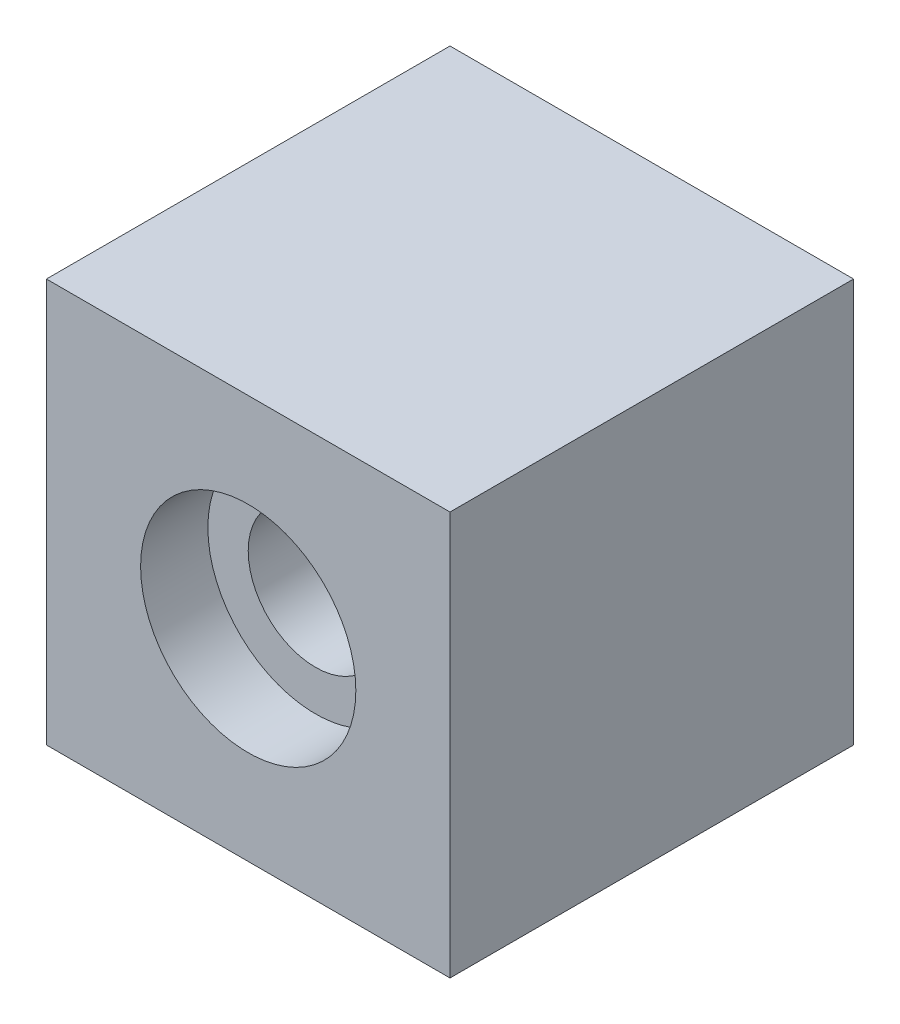
ISO-10303-21;
HEADER;
FILE_DESCRIPTION(('STEP AP214'),'2;1');
FILE_NAME('part.step','',(''),(''),'','','');
FILE_SCHEMA(('AUTOMOTIVE_DESIGN { 1 0 10303 214 1 1 1 1 }'));
ENDSEC;
DATA;
#1=APPLICATION_CONTEXT('core data for automotive mechanical design processes');
#2=APPLICATION_PROTOCOL_DEFINITION('international standard','automotive_design',2000,#1);
#3=PRODUCT_CONTEXT('',#1,'mechanical');
#4=PRODUCT('Part','Part','',(#3));
#5=PRODUCT_RELATED_PRODUCT_CATEGORY('part','',(#4));
#6=PRODUCT_DEFINITION_FORMATION('','',#4);
#7=PRODUCT_DEFINITION_CONTEXT('part definition',#1,'design');
#8=PRODUCT_DEFINITION('design','',#6,#7);
#9=PRODUCT_DEFINITION_SHAPE('','',#8);
#10=(LENGTH_UNIT() NAMED_UNIT(*) SI_UNIT(.MILLI.,.METRE.));
#11=(NAMED_UNIT(*) PLANE_ANGLE_UNIT() SI_UNIT($,.RADIAN.));
#12=(NAMED_UNIT(*) SI_UNIT($,.STERADIAN.) SOLID_ANGLE_UNIT());
#13=UNCERTAINTY_MEASURE_WITH_UNIT(LENGTH_MEASURE(1.E-05),#10,'distance_accuracy_value','');
#14=(GEOMETRIC_REPRESENTATION_CONTEXT(3) GLOBAL_UNCERTAINTY_ASSIGNED_CONTEXT((#13)) GLOBAL_UNIT_ASSIGNED_CONTEXT((#10,
#11,#12)) REPRESENTATION_CONTEXT('',''));
#15=CARTESIAN_POINT('',(0.,0.,0.));
#16=DIRECTION('',(0.,0.,1.));
#17=DIRECTION('',(1.,0.,0.));
#18=AXIS2_PLACEMENT_3D('',#15,#16,#17);
#19=CARTESIAN_POINT('',(15.,15.,15.));
#20=DIRECTION('',(0.,0.,-1.));
#21=DIRECTION('',(-1.,0.,0.));
#22=AXIS2_PLACEMENT_3D('',#19,#20,#21);
#23=CYLINDRICAL_SURFACE('',#22,5.);
#24=CARTESIAN_POINT('',(15.,15.,10.));
#25=DIRECTION('',(0.,0.,1.));
#26=DIRECTION('',(1.,0.,0.));
#27=AXIS2_PLACEMENT_3D('',#24,#25,#26);
#28=CIRCLE('',#27,5.);
#29=CARTESIAN_POINT('',(20.,15.,10.));
#30=VERTEX_POINT('',#29);
#31=EDGE_CURVE('E136',#30,#30,#28,.T.);
#32=ORIENTED_EDGE('',*,*,#31,.T.);
#33=EDGE_LOOP('',(#32));
#34=FACE_BOUND('',#33,.T.);
#35=CARTESIAN_POINT('',(15.,15.,-10.));
#36=DIRECTION('',(0.,0.,-1.));
#37=DIRECTION('',(-1.,0.,0.));
#38=AXIS2_PLACEMENT_3D('',#35,#36,#37);
#39=CIRCLE('',#38,5.);
#40=CARTESIAN_POINT('',(10.,15.,-10.));
#41=VERTEX_POINT('',#40);
#42=EDGE_CURVE('E64',#41,#41,#39,.T.);
#43=ORIENTED_EDGE('',*,*,#42,.T.);
#44=EDGE_LOOP('',(#43));
#45=FACE_BOUND('',#44,.T.);
#46=ADVANCED_FACE('F60',(#34,#45),#23,.F.);
#47=CARTESIAN_POINT('',(0.,0.,15.));
#48=DIRECTION('',(0.,0.,-1.));
#49=DIRECTION('',(-1.,0.,0.));
#50=AXIS2_PLACEMENT_3D('',#47,#48,#49);
#51=PLANE('',#50);
#52=CARTESIAN_POINT('',(15.,15.,15.));
#53=DIRECTION('',(0.,0.,1.));
#54=DIRECTION('',(1.,0.,0.));
#55=AXIS2_PLACEMENT_3D('',#52,#53,#54);
#56=CIRCLE('',#55,8.);
#57=CARTESIAN_POINT('',(23.,15.,15.));
#58=VERTEX_POINT('',#57);
#59=EDGE_CURVE('E153',#58,#58,#56,.T.);
#60=ORIENTED_EDGE('',*,*,#59,.F.);
#61=EDGE_LOOP('',(#60));
#62=FACE_BOUND('',#61,.T.);
#63=DIRECTION('',(0.,-1.,0.));
#64=VECTOR('',#63,1.);
#65=CARTESIAN_POINT('',(0.,0.,15.));
#66=LINE('',#65,#64);
#67=CARTESIAN_POINT('',(0.,30.,15.));
#68=VERTEX_POINT('',#67);
#69=CARTESIAN_POINT('',(0.,0.,15.));
#70=VERTEX_POINT('',#69);
#71=EDGE_CURVE('E115',#68,#70,#66,.T.);
#72=ORIENTED_EDGE('',*,*,#71,.T.);
#73=DIRECTION('',(1.,0.,0.));
#74=VECTOR('',#73,1.);
#75=CARTESIAN_POINT('',(0.,0.,15.));
#76=LINE('',#75,#74);
#77=CARTESIAN_POINT('',(30.,0.,15.));
#78=VERTEX_POINT('',#77);
#79=EDGE_CURVE('E110',#70,#78,#76,.T.);
#80=ORIENTED_EDGE('',*,*,#79,.T.);
#81=DIRECTION('',(0.,1.,0.));
#82=VECTOR('',#81,1.);
#83=CARTESIAN_POINT('',(30.,0.,15.));
#84=LINE('',#83,#82);
#85=CARTESIAN_POINT('',(30.,30.,15.));
#86=VERTEX_POINT('',#85);
#87=EDGE_CURVE('E113',#78,#86,#84,.T.);
#88=ORIENTED_EDGE('',*,*,#87,.T.);
#89=DIRECTION('',(-1.,0.,0.));
#90=VECTOR('',#89,1.);
#91=CARTESIAN_POINT('',(0.,30.,15.));
#92=LINE('',#91,#90);
#93=EDGE_CURVE('E80',#86,#68,#92,.T.);
#94=ORIENTED_EDGE('',*,*,#93,.T.);
#95=EDGE_LOOP('',(#72,#80,#88,#94));
#96=FACE_BOUND('',#95,.T.);
#97=ADVANCED_FACE('F111',(#62,#96),#51,.F.);
#98=CARTESIAN_POINT('',(0.,0.,-15.));
#99=DIRECTION('',(0.,0.,-1.));
#100=DIRECTION('',(-1.,0.,0.));
#101=AXIS2_PLACEMENT_3D('',#98,#99,#100);
#102=PLANE('',#101);
#103=CARTESIAN_POINT('',(15.,15.,-15.));
#104=DIRECTION('',(0.,0.,1.));
#105=DIRECTION('',(1.,0.,0.));
#106=AXIS2_PLACEMENT_3D('',#103,#104,#105);
#107=CIRCLE('',#106,8.);
#108=CARTESIAN_POINT('',(23.,15.,-15.));
#109=VERTEX_POINT('',#108);
#110=EDGE_CURVE('E161',#109,#109,#107,.T.);
#111=ORIENTED_EDGE('',*,*,#110,.T.);
#112=EDGE_LOOP('',(#111));
#113=FACE_BOUND('',#112,.T.);
#114=DIRECTION('',(0.,-1.,0.));
#115=VECTOR('',#114,1.);
#116=CARTESIAN_POINT('',(0.,0.,-15.));
#117=LINE('',#116,#115);
#118=CARTESIAN_POINT('',(0.,30.,-15.));
#119=VERTEX_POINT('',#118);
#120=CARTESIAN_POINT('',(0.,0.,-15.));
#121=VERTEX_POINT('',#120);
#122=EDGE_CURVE('E132',#119,#121,#117,.T.);
#123=ORIENTED_EDGE('',*,*,#122,.F.);
#124=DIRECTION('',(-1.,0.,0.));
#125=VECTOR('',#124,1.);
#126=CARTESIAN_POINT('',(0.,30.,-15.));
#127=LINE('',#126,#125);
#128=CARTESIAN_POINT('',(30.,30.,-15.));
#129=VERTEX_POINT('',#128);
#130=EDGE_CURVE('E103',#129,#119,#127,.T.);
#131=ORIENTED_EDGE('',*,*,#130,.F.);
#132=DIRECTION('',(0.,1.,0.));
#133=VECTOR('',#132,1.);
#134=CARTESIAN_POINT('',(30.,0.,-15.));
#135=LINE('',#134,#133);
#136=CARTESIAN_POINT('',(30.,0.,-15.));
#137=VERTEX_POINT('',#136);
#138=EDGE_CURVE('E97',#137,#129,#135,.T.);
#139=ORIENTED_EDGE('',*,*,#138,.F.);
#140=DIRECTION('',(1.,0.,0.));
#141=VECTOR('',#140,1.);
#142=CARTESIAN_POINT('',(0.,0.,-15.));
#143=LINE('',#142,#141);
#144=EDGE_CURVE('E120',#121,#137,#143,.T.);
#145=ORIENTED_EDGE('',*,*,#144,.F.);
#146=EDGE_LOOP('',(#123,#131,#139,#145));
#147=FACE_BOUND('',#146,.T.);
#148=ADVANCED_FACE('F191',(#113,#147),#102,.T.);
#149=CARTESIAN_POINT('',(0.,0.,15.));
#150=DIRECTION('',(1.,0.,0.));
#151=DIRECTION('',(0.,0.,-1.));
#152=AXIS2_PLACEMENT_3D('',#149,#150,#151);
#153=PLANE('',#152);
#154=ORIENTED_EDGE('',*,*,#122,.T.);
#155=DIRECTION('',(0.,0.,-1.));
#156=VECTOR('',#155,1.);
#157=CARTESIAN_POINT('',(0.,0.,15.));
#158=LINE('',#157,#156);
#159=EDGE_CURVE('E12',#70,#121,#158,.T.);
#160=ORIENTED_EDGE('',*,*,#159,.F.);
#161=ORIENTED_EDGE('',*,*,#71,.F.);
#162=DIRECTION('',(0.,0.,-1.));
#163=VECTOR('',#162,1.);
#164=CARTESIAN_POINT('',(0.,30.,15.));
#165=LINE('',#164,#163);
#166=EDGE_CURVE('E128',#68,#119,#165,.T.);
#167=ORIENTED_EDGE('',*,*,#166,.T.);
#168=EDGE_LOOP('',(#154,#160,#161,#167));
#169=FACE_BOUND('',#168,.T.);
#170=ADVANCED_FACE('F62',(#169),#153,.F.);
#171=CARTESIAN_POINT('',(0.,0.,15.));
#172=DIRECTION('',(0.,1.,0.));
#173=DIRECTION('',(0.,0.,1.));
#174=AXIS2_PLACEMENT_3D('',#171,#172,#173);
#175=PLANE('',#174);
#176=ORIENTED_EDGE('',*,*,#144,.T.);
#177=DIRECTION('',(0.,0.,-1.));
#178=VECTOR('',#177,1.);
#179=CARTESIAN_POINT('',(30.,0.,15.));
#180=LINE('',#179,#178);
#181=EDGE_CURVE('E71',#78,#137,#180,.T.);
#182=ORIENTED_EDGE('',*,*,#181,.F.);
#183=ORIENTED_EDGE('',*,*,#79,.F.);
#184=ORIENTED_EDGE('',*,*,#159,.T.);
#185=EDGE_LOOP('',(#176,#182,#183,#184));
#186=FACE_BOUND('',#185,.T.);
#187=ADVANCED_FACE('F119',(#186),#175,.F.);
#188=CARTESIAN_POINT('',(30.,0.,15.));
#189=DIRECTION('',(-1.,0.,0.));
#190=DIRECTION('',(0.,0.,1.));
#191=AXIS2_PLACEMENT_3D('',#188,#189,#190);
#192=PLANE('',#191);
#193=ORIENTED_EDGE('',*,*,#138,.T.);
#194=DIRECTION('',(0.,0.,-1.));
#195=VECTOR('',#194,1.);
#196=CARTESIAN_POINT('',(30.,30.,15.));
#197=LINE('',#196,#195);
#198=EDGE_CURVE('E122',#86,#129,#197,.T.);
#199=ORIENTED_EDGE('',*,*,#198,.F.);
#200=ORIENTED_EDGE('',*,*,#87,.F.);
#201=ORIENTED_EDGE('',*,*,#181,.T.);
#202=EDGE_LOOP('',(#193,#199,#200,#201));
#203=FACE_BOUND('',#202,.T.);
#204=ADVANCED_FACE('F124',(#203),#192,.F.);
#205=CARTESIAN_POINT('',(0.,30.,15.));
#206=DIRECTION('',(0.,-1.,0.));
#207=DIRECTION('',(0.,0.,-1.));
#208=AXIS2_PLACEMENT_3D('',#205,#206,#207);
#209=PLANE('',#208);
#210=ORIENTED_EDGE('',*,*,#130,.T.);
#211=ORIENTED_EDGE('',*,*,#166,.F.);
#212=ORIENTED_EDGE('',*,*,#93,.F.);
#213=ORIENTED_EDGE('',*,*,#198,.T.);
#214=EDGE_LOOP('',(#210,#211,#212,#213));
#215=FACE_BOUND('',#214,.T.);
#216=ADVANCED_FACE('F201',(#215),#209,.F.);
#217=CARTESIAN_POINT('',(15.,15.,10.));
#218=DIRECTION('',(0.,0.,1.));
#219=DIRECTION('',(1.,0.,0.));
#220=AXIS2_PLACEMENT_3D('',#217,#218,#219);
#221=CYLINDRICAL_SURFACE('',#220,8.);
#222=CARTESIAN_POINT('',(15.,15.,10.));
#223=DIRECTION('',(0.,0.,1.));
#224=DIRECTION('',(1.,0.,0.));
#225=AXIS2_PLACEMENT_3D('',#222,#223,#224);
#226=CIRCLE('',#225,8.);
#227=CARTESIAN_POINT('',(23.,15.,10.));
#228=VERTEX_POINT('',#227);
#229=EDGE_CURVE('E148',#228,#228,#226,.T.);
#230=ORIENTED_EDGE('',*,*,#229,.F.);
#231=EDGE_LOOP('',(#230));
#232=FACE_BOUND('',#231,.T.);
#233=ORIENTED_EDGE('',*,*,#59,.T.);
#234=EDGE_LOOP('',(#233));
#235=FACE_BOUND('',#234,.T.);
#236=ADVANCED_FACE('F195',(#232,#235),#221,.F.);
#237=CARTESIAN_POINT('',(15.,15.,10.));
#238=DIRECTION('',(0.,0.,1.));
#239=DIRECTION('',(1.,0.,0.));
#240=AXIS2_PLACEMENT_3D('',#237,#238,#239);
#241=PLANE('',#240);
#242=ORIENTED_EDGE('',*,*,#31,.F.);
#243=EDGE_LOOP('',(#242));
#244=FACE_BOUND('',#243,.T.);
#245=ORIENTED_EDGE('',*,*,#229,.T.);
#246=EDGE_LOOP('',(#245));
#247=FACE_BOUND('',#246,.T.);
#248=ADVANCED_FACE('F184',(#244,#247),#241,.T.);
#249=CARTESIAN_POINT('',(15.,15.,-10.));
#250=DIRECTION('',(0.,0.,-1.));
#251=DIRECTION('',(-1.,0.,0.));
#252=AXIS2_PLACEMENT_3D('',#249,#250,#251);
#253=CYLINDRICAL_SURFACE('',#252,8.);
#254=CARTESIAN_POINT('',(15.,15.,-10.));
#255=DIRECTION('',(0.,0.,1.));
#256=DIRECTION('',(1.,0.,0.));
#257=AXIS2_PLACEMENT_3D('',#254,#255,#256);
#258=CIRCLE('',#257,8.);
#259=CARTESIAN_POINT('',(23.,15.,-10.));
#260=VERTEX_POINT('',#259);
#261=EDGE_CURVE('E166',#260,#260,#258,.T.);
#262=ORIENTED_EDGE('',*,*,#261,.T.);
#263=EDGE_LOOP('',(#262));
#264=FACE_BOUND('',#263,.T.);
#265=ORIENTED_EDGE('',*,*,#110,.F.);
#266=EDGE_LOOP('',(#265));
#267=FACE_BOUND('',#266,.T.);
#268=ADVANCED_FACE('F179',(#264,#267),#253,.F.);
#269=CARTESIAN_POINT('',(15.,15.,-10.));
#270=DIRECTION('',(0.,0.,-1.));
#271=DIRECTION('',(1.,0.,0.));
#272=AXIS2_PLACEMENT_3D('',#269,#270,#271);
#273=PLANE('',#272);
#274=ORIENTED_EDGE('',*,*,#42,.F.);
#275=EDGE_LOOP('',(#274));
#276=FACE_BOUND('',#275,.T.);
#277=ORIENTED_EDGE('',*,*,#261,.F.);
#278=EDGE_LOOP('',(#277));
#279=FACE_BOUND('',#278,.T.);
#280=ADVANCED_FACE('F176',(#276,#279),#273,.T.);
#281=CLOSED_SHELL('',(#46,#97,#148,#170,#187,#204,#216,#236,#248,#268,#280));
#282=MANIFOLD_SOLID_BREP('B2',#281);
#283=ADVANCED_BREP_SHAPE_REPRESENTATION('',(#18,#282),#14);
#284=SHAPE_DEFINITION_REPRESENTATION(#9,#283);
ENDSEC;
END-ISO-10303-21;
